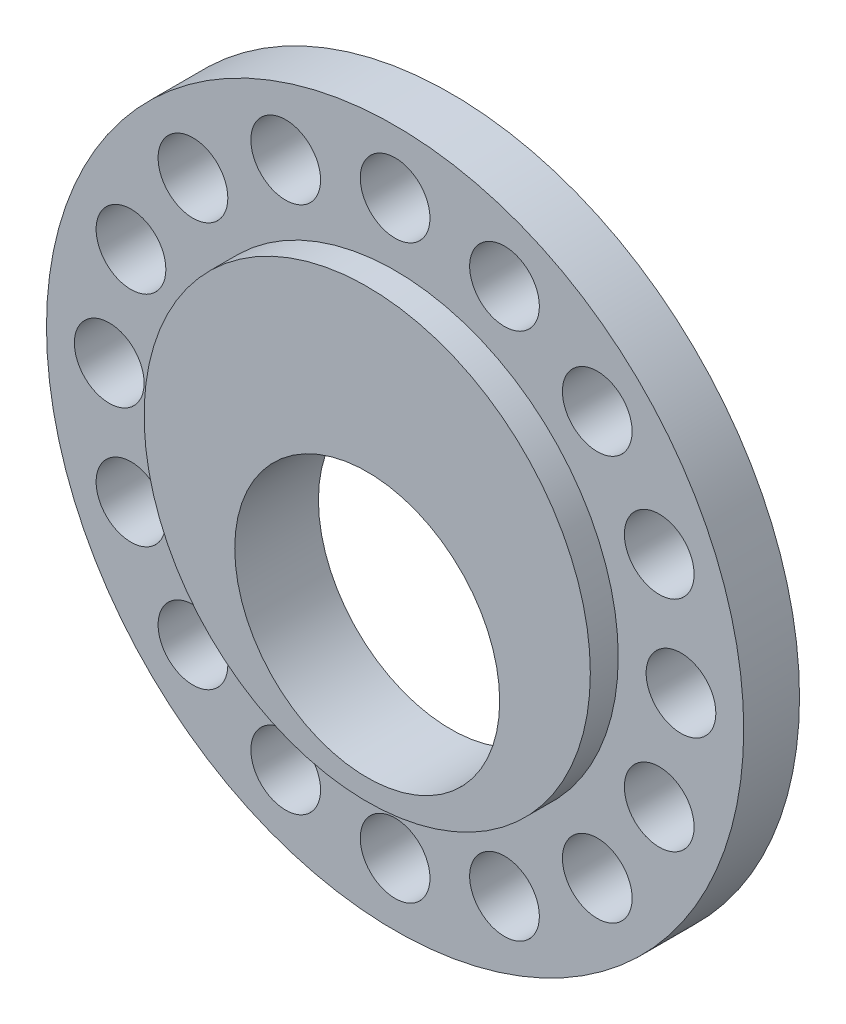
ISO-10303-21;
HEADER;
FILE_DESCRIPTION(('STEP AP214'),'2;1');
FILE_NAME('part.step','',(''),(''),'','','');
FILE_SCHEMA(('AUTOMOTIVE_DESIGN { 1 0 10303 214 1 1 1 1 }'));
ENDSEC;
DATA;
#1=APPLICATION_CONTEXT('core data for automotive mechanical design processes');
#2=APPLICATION_PROTOCOL_DEFINITION('international standard','automotive_design',2000,#1);
#3=PRODUCT_CONTEXT('',#1,'mechanical');
#4=PRODUCT('Part','Part','',(#3));
#5=PRODUCT_RELATED_PRODUCT_CATEGORY('part','',(#4));
#6=PRODUCT_DEFINITION_FORMATION('','',#4);
#7=PRODUCT_DEFINITION_CONTEXT('part definition',#1,'design');
#8=PRODUCT_DEFINITION('design','',#6,#7);
#9=PRODUCT_DEFINITION_SHAPE('','',#8);
#10=(LENGTH_UNIT() NAMED_UNIT(*) SI_UNIT(.MILLI.,.METRE.));
#11=(NAMED_UNIT(*) PLANE_ANGLE_UNIT() SI_UNIT($,.RADIAN.));
#12=(NAMED_UNIT(*) SI_UNIT($,.STERADIAN.) SOLID_ANGLE_UNIT());
#13=UNCERTAINTY_MEASURE_WITH_UNIT(LENGTH_MEASURE(1.E-05),#10,'distance_accuracy_value','');
#14=(GEOMETRIC_REPRESENTATION_CONTEXT(3) GLOBAL_UNCERTAINTY_ASSIGNED_CONTEXT((#13)) GLOBAL_UNIT_ASSIGNED_CONTEXT((#10,
#11,#12)) REPRESENTATION_CONTEXT('',''));
#15=CARTESIAN_POINT('',(0.,0.,0.));
#16=DIRECTION('',(0.,0.,1.));
#17=DIRECTION('',(1.,0.,0.));
#18=AXIS2_PLACEMENT_3D('',#15,#16,#17);
#19=CARTESIAN_POINT('',(0.,-5.,6.));
#20=DIRECTION('',(0.,0.,-1.));
#21=DIRECTION('',(-1.,0.,0.));
#22=AXIS2_PLACEMENT_3D('',#19,#20,#21);
#23=CYLINDRICAL_SURFACE('',#22,9.5);
#24=CARTESIAN_POINT('',(0.,-5.,6.));
#25=DIRECTION('',(0.,0.,1.));
#26=DIRECTION('',(1.,0.,0.));
#27=AXIS2_PLACEMENT_3D('',#24,#25,#26);
#28=CIRCLE('',#27,9.5);
#29=CARTESIAN_POINT('',(9.5,-5.,6.));
#30=VERTEX_POINT('',#29);
#31=EDGE_CURVE('E52',#30,#30,#28,.T.);
#32=ORIENTED_EDGE('',*,*,#31,.T.);
#33=EDGE_LOOP('',(#32));
#34=FACE_BOUND('',#33,.T.);
#35=CARTESIAN_POINT('',(0.,-5.,0.));
#36=DIRECTION('',(0.,0.,1.));
#37=DIRECTION('',(1.,0.,0.));
#38=AXIS2_PLACEMENT_3D('',#35,#36,#37);
#39=CIRCLE('',#38,9.5);
#40=CARTESIAN_POINT('',(9.5,-5.,0.));
#41=VERTEX_POINT('',#40);
#42=EDGE_CURVE('E47',#41,#41,#39,.T.);
#43=ORIENTED_EDGE('',*,*,#42,.F.);
#44=EDGE_LOOP('',(#43));
#45=FACE_BOUND('',#44,.T.);
#46=ADVANCED_FACE('F44',(#34,#45),#23,.F.);
#47=CARTESIAN_POINT('',(0.,0.,6.));
#48=DIRECTION('',(0.,0.,-1.));
#49=DIRECTION('',(-1.,0.,0.));
#50=AXIS2_PLACEMENT_3D('',#47,#48,#49);
#51=CYLINDRICAL_SURFACE('',#50,16.);
#52=CARTESIAN_POINT('',(0.,0.,4.));
#53=DIRECTION('',(0.,0.,1.));
#54=DIRECTION('',(1.,0.,0.));
#55=AXIS2_PLACEMENT_3D('',#52,#53,#54);
#56=CIRCLE('',#55,16.);
#57=CARTESIAN_POINT('',(16.,0.,4.));
#58=VERTEX_POINT('',#57);
#59=EDGE_CURVE('E159',#58,#58,#56,.T.);
#60=ORIENTED_EDGE('',*,*,#59,.T.);
#61=EDGE_LOOP('',(#60));
#62=FACE_BOUND('',#61,.T.);
#63=CARTESIAN_POINT('',(0.,0.,6.));
#64=DIRECTION('',(0.,0.,1.));
#65=DIRECTION('',(1.,0.,0.));
#66=AXIS2_PLACEMENT_3D('',#63,#64,#65);
#67=CIRCLE('',#66,16.);
#68=CARTESIAN_POINT('',(16.,0.,6.));
#69=VERTEX_POINT('',#68);
#70=EDGE_CURVE('E11',#69,#69,#67,.T.);
#71=ORIENTED_EDGE('',*,*,#70,.F.);
#72=EDGE_LOOP('',(#71));
#73=FACE_BOUND('',#72,.T.);
#74=ADVANCED_FACE('F231',(#62,#73),#51,.T.);
#75=CARTESIAN_POINT('',(0.,0.,6.));
#76=DIRECTION('',(0.,0.,1.));
#77=DIRECTION('',(1.,0.,0.));
#78=AXIS2_PLACEMENT_3D('',#75,#76,#77);
#79=PLANE('',#78);
#80=ORIENTED_EDGE('',*,*,#31,.F.);
#81=EDGE_LOOP('',(#80));
#82=FACE_BOUND('',#81,.T.);
#83=ORIENTED_EDGE('',*,*,#70,.T.);
#84=EDGE_LOOP('',(#83));
#85=FACE_BOUND('',#84,.T.);
#86=ADVANCED_FACE('F220',(#82,#85),#79,.T.);
#87=CARTESIAN_POINT('',(0.,0.,0.));
#88=DIRECTION('',(0.,0.,1.));
#89=DIRECTION('',(1.,0.,0.));
#90=AXIS2_PLACEMENT_3D('',#87,#88,#89);
#91=PLANE('',#90);
#92=ORIENTED_EDGE('',*,*,#42,.T.);
#93=EDGE_LOOP('',(#92));
#94=FACE_BOUND('',#93,.T.);
#95=CARTESIAN_POINT('',(-18.9395304164815,-7.84501036348408,0.));
#96=DIRECTION('',(0.,0.,1.));
#97=DIRECTION('',(1.,0.,0.));
#98=AXIS2_PLACEMENT_3D('',#95,#96,#97);
#99=CIRCLE('',#98,2.5);
#100=CARTESIAN_POINT('',(-16.4395304164815,-7.84501036348408,0.));
#101=VERTEX_POINT('',#100);
#102=EDGE_CURVE('E149',#101,#101,#99,.T.);
#103=ORIENTED_EDGE('',*,*,#102,.T.);
#104=EDGE_LOOP('',(#103));
#105=FACE_BOUND('',#104,.T.);
#106=CARTESIAN_POINT('',(-14.4956890143244,-14.495689014324,0.));
#107=DIRECTION('',(0.,0.,1.));
#108=DIRECTION('',(1.,0.,0.));
#109=AXIS2_PLACEMENT_3D('',#106,#107,#108);
#110=CIRCLE('',#109,2.5);
#111=CARTESIAN_POINT('',(-11.9956890143244,-14.495689014324,0.));
#112=VERTEX_POINT('',#111);
#113=EDGE_CURVE('E144',#112,#112,#110,.T.);
#114=ORIENTED_EDGE('',*,*,#113,.T.);
#115=EDGE_LOOP('',(#114));
#116=FACE_BOUND('',#115,.T.);
#117=CARTESIAN_POINT('',(-7.84501036348433,-18.9395304164814,0.));
#118=DIRECTION('',(0.,0.,1.));
#119=DIRECTION('',(1.,0.,0.));
#120=AXIS2_PLACEMENT_3D('',#117,#118,#119);
#121=CIRCLE('',#120,2.50000000000023);
#122=CARTESIAN_POINT('',(-5.34501036348409,-18.9395304164814,0.));
#123=VERTEX_POINT('',#122);
#124=EDGE_CURVE('E139',#123,#123,#121,.T.);
#125=ORIENTED_EDGE('',*,*,#124,.T.);
#126=EDGE_LOOP('',(#125));
#127=FACE_BOUND('',#126,.T.);
#128=CARTESIAN_POINT('',(0.,-20.5,0.));
#129=DIRECTION('',(0.,0.,1.));
#130=DIRECTION('',(1.,0.,0.));
#131=AXIS2_PLACEMENT_3D('',#128,#129,#130);
#132=CIRCLE('',#131,2.50000000000023);
#133=CARTESIAN_POINT('',(2.50000000000027,-20.5,0.));
#134=VERTEX_POINT('',#133);
#135=EDGE_CURVE('E135',#134,#134,#132,.T.);
#136=ORIENTED_EDGE('',*,*,#135,.T.);
#137=EDGE_LOOP('',(#136));
#138=FACE_BOUND('',#137,.T.);
#139=CARTESIAN_POINT('',(7.8450103634844,-18.9395304164814,0.));
#140=DIRECTION('',(0.,0.,1.));
#141=DIRECTION('',(1.,0.,0.));
#142=AXIS2_PLACEMENT_3D('',#139,#140,#141);
#143=CIRCLE('',#142,2.50000000000022);
#144=CARTESIAN_POINT('',(10.3450103634846,-18.9395304164814,0.));
#145=VERTEX_POINT('',#144);
#146=EDGE_CURVE('E127',#145,#145,#143,.T.);
#147=ORIENTED_EDGE('',*,*,#146,.T.);
#148=EDGE_LOOP('',(#147));
#149=FACE_BOUND('',#148,.T.);
#150=CARTESIAN_POINT('',(14.4956890143243,-14.4956890143243,0.));
#151=DIRECTION('',(0.,0.,1.));
#152=DIRECTION('',(1.,0.,0.));
#153=AXIS2_PLACEMENT_3D('',#150,#151,#152);
#154=CIRCLE('',#153,2.50000000000017);
#155=CARTESIAN_POINT('',(16.9956890143245,-14.4956890143243,0.));
#156=VERTEX_POINT('',#155);
#157=EDGE_CURVE('E122',#156,#156,#154,.T.);
#158=ORIENTED_EDGE('',*,*,#157,.T.);
#159=EDGE_LOOP('',(#158));
#160=FACE_BOUND('',#159,.T.);
#161=CARTESIAN_POINT('',(18.9395304164815,-7.84501036348437,0.));
#162=DIRECTION('',(0.,0.,1.));
#163=DIRECTION('',(1.,0.,0.));
#164=AXIS2_PLACEMENT_3D('',#161,#162,#163);
#165=CIRCLE('',#164,2.50000000000014);
#166=CARTESIAN_POINT('',(21.4395304164816,-7.84501036348437,0.));
#167=VERTEX_POINT('',#166);
#168=EDGE_CURVE('E117',#167,#167,#165,.T.);
#169=ORIENTED_EDGE('',*,*,#168,.T.);
#170=EDGE_LOOP('',(#169));
#171=FACE_BOUND('',#170,.T.);
#172=CARTESIAN_POINT('',(20.5000000000001,0.,0.));
#173=DIRECTION('',(0.,0.,1.));
#174=DIRECTION('',(1.,0.,0.));
#175=AXIS2_PLACEMENT_3D('',#172,#173,#174);
#176=CIRCLE('',#175,2.5000000000001);
#177=CARTESIAN_POINT('',(23.0000000000002,0.,0.));
#178=VERTEX_POINT('',#177);
#179=EDGE_CURVE('E113',#178,#178,#176,.T.);
#180=ORIENTED_EDGE('',*,*,#179,.T.);
#181=EDGE_LOOP('',(#180));
#182=FACE_BOUND('',#181,.T.);
#183=CARTESIAN_POINT('',(18.9395304164815,7.84501036348435,0.));
#184=DIRECTION('',(0.,0.,1.));
#185=DIRECTION('',(1.,0.,0.));
#186=AXIS2_PLACEMENT_3D('',#183,#184,#185);
#187=CIRCLE('',#186,2.50000000000007);
#188=CARTESIAN_POINT('',(21.4395304164815,7.84501036348435,0.));
#189=VERTEX_POINT('',#188);
#190=EDGE_CURVE('E105',#189,#189,#187,.T.);
#191=ORIENTED_EDGE('',*,*,#190,.T.);
#192=EDGE_LOOP('',(#191));
#193=FACE_BOUND('',#192,.T.);
#194=CARTESIAN_POINT('',(14.4956890143243,14.4956890143242,0.));
#195=DIRECTION('',(0.,0.,1.));
#196=DIRECTION('',(1.,0.,0.));
#197=AXIS2_PLACEMENT_3D('',#194,#195,#196);
#198=CIRCLE('',#197,2.50000000000005);
#199=CARTESIAN_POINT('',(16.9956890143243,14.4956890143242,0.));
#200=VERTEX_POINT('',#199);
#201=EDGE_CURVE('E100',#200,#200,#198,.T.);
#202=ORIENTED_EDGE('',*,*,#201,.T.);
#203=EDGE_LOOP('',(#202));
#204=FACE_BOUND('',#203,.T.);
#205=CARTESIAN_POINT('',(7.8450103634844,18.9395304164814,0.));
#206=DIRECTION('',(0.,0.,1.));
#207=DIRECTION('',(1.,0.,0.));
#208=AXIS2_PLACEMENT_3D('',#205,#206,#207);
#209=CIRCLE('',#208,2.50000000000003);
#210=CARTESIAN_POINT('',(10.3450103634844,18.9395304164814,0.));
#211=VERTEX_POINT('',#210);
#212=EDGE_CURVE('E95',#211,#211,#209,.T.);
#213=ORIENTED_EDGE('',*,*,#212,.T.);
#214=EDGE_LOOP('',(#213));
#215=FACE_BOUND('',#214,.T.);
#216=CARTESIAN_POINT('',(0.,20.5,0.));
#217=DIRECTION('',(0.,0.,1.));
#218=DIRECTION('',(1.,0.,0.));
#219=AXIS2_PLACEMENT_3D('',#216,#217,#218);
#220=CIRCLE('',#219,2.50000000000001);
#221=CARTESIAN_POINT('',(2.50000000000006,20.5,0.));
#222=VERTEX_POINT('',#221);
#223=EDGE_CURVE('E91',#222,#222,#220,.T.);
#224=ORIENTED_EDGE('',*,*,#223,.T.);
#225=EDGE_LOOP('',(#224));
#226=FACE_BOUND('',#225,.T.);
#227=CARTESIAN_POINT('',(-7.84501036348431,18.9395304164814,0.));
#228=DIRECTION('',(0.,0.,1.));
#229=DIRECTION('',(1.,0.,0.));
#230=AXIS2_PLACEMENT_3D('',#227,#228,#229);
#231=CIRCLE('',#230,2.50000000000001);
#232=CARTESIAN_POINT('',(-5.34501036348431,18.9395304164814,0.));
#233=VERTEX_POINT('',#232);
#234=EDGE_CURVE('E83',#233,#233,#231,.T.);
#235=ORIENTED_EDGE('',*,*,#234,.T.);
#236=EDGE_LOOP('',(#235));
#237=FACE_BOUND('',#236,.T.);
#238=CARTESIAN_POINT('',(-14.4956890143242,14.4956890143243,0.));
#239=DIRECTION('',(0.,0.,1.));
#240=DIRECTION('',(1.,0.,0.));
#241=AXIS2_PLACEMENT_3D('',#238,#239,#240);
#242=CIRCLE('',#241,2.5);
#243=CARTESIAN_POINT('',(-11.9956890143242,14.4956890143243,0.));
#244=VERTEX_POINT('',#243);
#245=EDGE_CURVE('E78',#244,#244,#242,.T.);
#246=ORIENTED_EDGE('',*,*,#245,.T.);
#247=EDGE_LOOP('',(#246));
#248=FACE_BOUND('',#247,.T.);
#249=CARTESIAN_POINT('',(-18.9395304164814,7.84501036348436,0.));
#250=DIRECTION('',(0.,0.,1.));
#251=DIRECTION('',(1.,0.,0.));
#252=AXIS2_PLACEMENT_3D('',#249,#250,#251);
#253=CIRCLE('',#252,2.5);
#254=CARTESIAN_POINT('',(-16.4395304164814,7.84501036348436,0.));
#255=VERTEX_POINT('',#254);
#256=EDGE_CURVE('E73',#255,#255,#253,.T.);
#257=ORIENTED_EDGE('',*,*,#256,.T.);
#258=EDGE_LOOP('',(#257));
#259=FACE_BOUND('',#258,.T.);
#260=CARTESIAN_POINT('',(-20.5,0.,0.));
#261=DIRECTION('',(0.,0.,1.));
#262=DIRECTION('',(1.,0.,0.));
#263=AXIS2_PLACEMENT_3D('',#260,#261,#262);
#264=CIRCLE('',#263,2.5);
#265=CARTESIAN_POINT('',(-18.,0.,0.));
#266=VERTEX_POINT('',#265);
#267=EDGE_CURVE('E69',#266,#266,#264,.T.);
#268=ORIENTED_EDGE('',*,*,#267,.T.);
#269=EDGE_LOOP('',(#268));
#270=FACE_BOUND('',#269,.T.);
#271=CARTESIAN_POINT('',(0.,0.,0.));
#272=DIRECTION('',(0.,0.,1.));
#273=DIRECTION('',(1.,0.,0.));
#274=AXIS2_PLACEMENT_3D('',#271,#272,#273);
#275=CIRCLE('',#274,25.);
#276=CARTESIAN_POINT('',(25.,0.,0.));
#277=VERTEX_POINT('',#276);
#278=EDGE_CURVE('E61',#277,#277,#275,.T.);
#279=ORIENTED_EDGE('',*,*,#278,.F.);
#280=EDGE_LOOP('',(#279));
#281=FACE_BOUND('',#280,.T.);
#282=ADVANCED_FACE('F217',(#94,#105,#116,#127,#138,#149,#160,#171,#182,#193,#204,#215,#226,#237,
#248,#259,#270,#281),#91,.F.);
#283=CARTESIAN_POINT('',(-20.5,0.,4.));
#284=DIRECTION('',(0.,0.,-1.));
#285=DIRECTION('',(-1.,0.,0.));
#286=AXIS2_PLACEMENT_3D('',#283,#284,#285);
#287=CYLINDRICAL_SURFACE('',#286,2.5);
#288=CARTESIAN_POINT('',(-20.5,0.,4.));
#289=DIRECTION('',(0.,0.,1.));
#290=DIRECTION('',(1.,0.,0.));
#291=AXIS2_PLACEMENT_3D('',#288,#289,#290);
#292=CIRCLE('',#291,2.5);
#293=CARTESIAN_POINT('',(-18.,0.,4.));
#294=VERTEX_POINT('',#293);
#295=EDGE_CURVE('E162',#294,#294,#292,.T.);
#296=ORIENTED_EDGE('',*,*,#295,.T.);
#297=EDGE_LOOP('',(#296));
#298=FACE_BOUND('',#297,.T.);
#299=ORIENTED_EDGE('',*,*,#267,.F.);
#300=EDGE_LOOP('',(#299));
#301=FACE_BOUND('',#300,.T.);
#302=ADVANCED_FACE('F219',(#298,#301),#287,.F.);
#303=CARTESIAN_POINT('',(-18.9395304164814,7.84501036348436,4.));
#304=DIRECTION('',(0.,0.,-1.));
#305=DIRECTION('',(-1.,0.,0.));
#306=AXIS2_PLACEMENT_3D('',#303,#304,#305);
#307=CYLINDRICAL_SURFACE('',#306,2.5);
#308=CARTESIAN_POINT('',(-18.9395304164814,7.84501036348436,4.));
#309=DIRECTION('',(0.,0.,1.));
#310=DIRECTION('',(1.,0.,0.));
#311=AXIS2_PLACEMENT_3D('',#308,#309,#310);
#312=CIRCLE('',#311,2.5);
#313=CARTESIAN_POINT('',(-16.4395304164814,7.84501036348436,4.));
#314=VERTEX_POINT('',#313);
#315=EDGE_CURVE('E165',#314,#314,#312,.T.);
#316=ORIENTED_EDGE('',*,*,#315,.T.);
#317=EDGE_LOOP('',(#316));
#318=FACE_BOUND('',#317,.T.);
#319=ORIENTED_EDGE('',*,*,#256,.F.);
#320=EDGE_LOOP('',(#319));
#321=FACE_BOUND('',#320,.T.);
#322=ADVANCED_FACE('F227',(#318,#321),#307,.F.);
#323=CARTESIAN_POINT('',(-14.4956890143242,14.4956890143243,4.));
#324=DIRECTION('',(0.,0.,-1.));
#325=DIRECTION('',(-1.,0.,0.));
#326=AXIS2_PLACEMENT_3D('',#323,#324,#325);
#327=CYLINDRICAL_SURFACE('',#326,2.5);
#328=CARTESIAN_POINT('',(-14.4956890143242,14.4956890143243,4.));
#329=DIRECTION('',(0.,0.,1.));
#330=DIRECTION('',(1.,0.,0.));
#331=AXIS2_PLACEMENT_3D('',#328,#329,#330);
#332=CIRCLE('',#331,2.5);
#333=CARTESIAN_POINT('',(-11.9956890143242,14.4956890143243,4.));
#334=VERTEX_POINT('',#333);
#335=EDGE_CURVE('E168',#334,#334,#332,.T.);
#336=ORIENTED_EDGE('',*,*,#335,.T.);
#337=EDGE_LOOP('',(#336));
#338=FACE_BOUND('',#337,.T.);
#339=ORIENTED_EDGE('',*,*,#245,.F.);
#340=EDGE_LOOP('',(#339));
#341=FACE_BOUND('',#340,.T.);
#342=ADVANCED_FACE('F258',(#338,#341),#327,.F.);
#343=CARTESIAN_POINT('',(-7.84501036348431,18.9395304164814,4.));
#344=DIRECTION('',(0.,0.,-1.));
#345=DIRECTION('',(-1.,0.,0.));
#346=AXIS2_PLACEMENT_3D('',#343,#344,#345);
#347=CYLINDRICAL_SURFACE('',#346,2.50000000000001);
#348=CARTESIAN_POINT('',(-7.84501036348431,18.9395304164814,4.));
#349=DIRECTION('',(0.,0.,1.));
#350=DIRECTION('',(1.,0.,0.));
#351=AXIS2_PLACEMENT_3D('',#348,#349,#350);
#352=CIRCLE('',#351,2.50000000000001);
#353=CARTESIAN_POINT('',(-5.34501036348431,18.9395304164814,4.));
#354=VERTEX_POINT('',#353);
#355=EDGE_CURVE('E171',#354,#354,#352,.T.);
#356=ORIENTED_EDGE('',*,*,#355,.T.);
#357=EDGE_LOOP('',(#356));
#358=FACE_BOUND('',#357,.T.);
#359=ORIENTED_EDGE('',*,*,#234,.F.);
#360=EDGE_LOOP('',(#359));
#361=FACE_BOUND('',#360,.T.);
#362=ADVANCED_FACE('F255',(#358,#361),#347,.F.);
#363=CARTESIAN_POINT('',(0.,20.5,4.));
#364=DIRECTION('',(0.,0.,-1.));
#365=DIRECTION('',(-1.,0.,0.));
#366=AXIS2_PLACEMENT_3D('',#363,#364,#365);
#367=CYLINDRICAL_SURFACE('',#366,2.50000000000001);
#368=CARTESIAN_POINT('',(0.,20.5,4.));
#369=DIRECTION('',(0.,0.,1.));
#370=DIRECTION('',(1.,0.,0.));
#371=AXIS2_PLACEMENT_3D('',#368,#369,#370);
#372=CIRCLE('',#371,2.50000000000001);
#373=CARTESIAN_POINT('',(2.50000000000006,20.5,4.));
#374=VERTEX_POINT('',#373);
#375=EDGE_CURVE('E174',#374,#374,#372,.T.);
#376=ORIENTED_EDGE('',*,*,#375,.T.);
#377=EDGE_LOOP('',(#376));
#378=FACE_BOUND('',#377,.T.);
#379=ORIENTED_EDGE('',*,*,#223,.F.);
#380=EDGE_LOOP('',(#379));
#381=FACE_BOUND('',#380,.T.);
#382=ADVANCED_FACE('F257',(#378,#381),#367,.F.);
#383=CARTESIAN_POINT('',(7.8450103634844,18.9395304164814,4.));
#384=DIRECTION('',(0.,0.,-1.));
#385=DIRECTION('',(-1.,0.,0.));
#386=AXIS2_PLACEMENT_3D('',#383,#384,#385);
#387=CYLINDRICAL_SURFACE('',#386,2.50000000000003);
#388=CARTESIAN_POINT('',(7.8450103634844,18.9395304164814,4.));
#389=DIRECTION('',(0.,0.,1.));
#390=DIRECTION('',(1.,0.,0.));
#391=AXIS2_PLACEMENT_3D('',#388,#389,#390);
#392=CIRCLE('',#391,2.50000000000003);
#393=CARTESIAN_POINT('',(10.3450103634844,18.9395304164814,4.));
#394=VERTEX_POINT('',#393);
#395=EDGE_CURVE('E177',#394,#394,#392,.T.);
#396=ORIENTED_EDGE('',*,*,#395,.T.);
#397=EDGE_LOOP('',(#396));
#398=FACE_BOUND('',#397,.T.);
#399=ORIENTED_EDGE('',*,*,#212,.F.);
#400=EDGE_LOOP('',(#399));
#401=FACE_BOUND('',#400,.T.);
#402=ADVANCED_FACE('F265',(#398,#401),#387,.F.);
#403=CARTESIAN_POINT('',(14.4956890143243,14.4956890143242,4.));
#404=DIRECTION('',(0.,0.,-1.));
#405=DIRECTION('',(-1.,0.,0.));
#406=AXIS2_PLACEMENT_3D('',#403,#404,#405);
#407=CYLINDRICAL_SURFACE('',#406,2.50000000000005);
#408=CARTESIAN_POINT('',(14.4956890143243,14.4956890143242,4.));
#409=DIRECTION('',(0.,0.,1.));
#410=DIRECTION('',(1.,0.,0.));
#411=AXIS2_PLACEMENT_3D('',#408,#409,#410);
#412=CIRCLE('',#411,2.50000000000005);
#413=CARTESIAN_POINT('',(16.9956890143243,14.4956890143242,4.));
#414=VERTEX_POINT('',#413);
#415=EDGE_CURVE('E180',#414,#414,#412,.T.);
#416=ORIENTED_EDGE('',*,*,#415,.T.);
#417=EDGE_LOOP('',(#416));
#418=FACE_BOUND('',#417,.T.);
#419=ORIENTED_EDGE('',*,*,#201,.F.);
#420=EDGE_LOOP('',(#419));
#421=FACE_BOUND('',#420,.T.);
#422=ADVANCED_FACE('F274',(#418,#421),#407,.F.);
#423=CARTESIAN_POINT('',(18.9395304164815,7.84501036348435,4.));
#424=DIRECTION('',(0.,0.,-1.));
#425=DIRECTION('',(-1.,0.,0.));
#426=AXIS2_PLACEMENT_3D('',#423,#424,#425);
#427=CYLINDRICAL_SURFACE('',#426,2.50000000000007);
#428=CARTESIAN_POINT('',(18.9395304164815,7.84501036348435,4.));
#429=DIRECTION('',(0.,0.,1.));
#430=DIRECTION('',(1.,0.,0.));
#431=AXIS2_PLACEMENT_3D('',#428,#429,#430);
#432=CIRCLE('',#431,2.50000000000007);
#433=CARTESIAN_POINT('',(21.4395304164815,7.84501036348435,4.));
#434=VERTEX_POINT('',#433);
#435=EDGE_CURVE('E183',#434,#434,#432,.T.);
#436=ORIENTED_EDGE('',*,*,#435,.T.);
#437=EDGE_LOOP('',(#436));
#438=FACE_BOUND('',#437,.T.);
#439=ORIENTED_EDGE('',*,*,#190,.F.);
#440=EDGE_LOOP('',(#439));
#441=FACE_BOUND('',#440,.T.);
#442=ADVANCED_FACE('F278',(#438,#441),#427,.F.);
#443=CARTESIAN_POINT('',(20.5000000000001,0.,4.));
#444=DIRECTION('',(0.,0.,-1.));
#445=DIRECTION('',(-1.,0.,0.));
#446=AXIS2_PLACEMENT_3D('',#443,#444,#445);
#447=CYLINDRICAL_SURFACE('',#446,2.5000000000001);
#448=CARTESIAN_POINT('',(20.5000000000001,0.,4.));
#449=DIRECTION('',(0.,0.,1.));
#450=DIRECTION('',(1.,0.,0.));
#451=AXIS2_PLACEMENT_3D('',#448,#449,#450);
#452=CIRCLE('',#451,2.5000000000001);
#453=CARTESIAN_POINT('',(23.0000000000002,0.,4.));
#454=VERTEX_POINT('',#453);
#455=EDGE_CURVE('E186',#454,#454,#452,.T.);
#456=ORIENTED_EDGE('',*,*,#455,.T.);
#457=EDGE_LOOP('',(#456));
#458=FACE_BOUND('',#457,.T.);
#459=ORIENTED_EDGE('',*,*,#179,.F.);
#460=EDGE_LOOP('',(#459));
#461=FACE_BOUND('',#460,.T.);
#462=ADVANCED_FACE('F282',(#458,#461),#447,.F.);
#463=CARTESIAN_POINT('',(18.9395304164815,-7.84501036348437,4.));
#464=DIRECTION('',(0.,0.,-1.));
#465=DIRECTION('',(-1.,0.,0.));
#466=AXIS2_PLACEMENT_3D('',#463,#464,#465);
#467=CYLINDRICAL_SURFACE('',#466,2.50000000000014);
#468=CARTESIAN_POINT('',(18.9395304164815,-7.84501036348437,4.));
#469=DIRECTION('',(0.,0.,1.));
#470=DIRECTION('',(1.,0.,0.));
#471=AXIS2_PLACEMENT_3D('',#468,#469,#470);
#472=CIRCLE('',#471,2.50000000000014);
#473=CARTESIAN_POINT('',(21.4395304164816,-7.84501036348437,4.));
#474=VERTEX_POINT('',#473);
#475=EDGE_CURVE('E189',#474,#474,#472,.T.);
#476=ORIENTED_EDGE('',*,*,#475,.T.);
#477=EDGE_LOOP('',(#476));
#478=FACE_BOUND('',#477,.T.);
#479=ORIENTED_EDGE('',*,*,#168,.F.);
#480=EDGE_LOOP('',(#479));
#481=FACE_BOUND('',#480,.T.);
#482=ADVANCED_FACE('F286',(#478,#481),#467,.F.);
#483=CARTESIAN_POINT('',(14.4956890143243,-14.4956890143243,4.));
#484=DIRECTION('',(0.,0.,-1.));
#485=DIRECTION('',(-1.,0.,0.));
#486=AXIS2_PLACEMENT_3D('',#483,#484,#485);
#487=CYLINDRICAL_SURFACE('',#486,2.50000000000017);
#488=CARTESIAN_POINT('',(14.4956890143243,-14.4956890143243,4.));
#489=DIRECTION('',(0.,0.,1.));
#490=DIRECTION('',(1.,0.,0.));
#491=AXIS2_PLACEMENT_3D('',#488,#489,#490);
#492=CIRCLE('',#491,2.50000000000017);
#493=CARTESIAN_POINT('',(16.9956890143245,-14.4956890143243,4.));
#494=VERTEX_POINT('',#493);
#495=EDGE_CURVE('E192',#494,#494,#492,.T.);
#496=ORIENTED_EDGE('',*,*,#495,.T.);
#497=EDGE_LOOP('',(#496));
#498=FACE_BOUND('',#497,.T.);
#499=ORIENTED_EDGE('',*,*,#157,.F.);
#500=EDGE_LOOP('',(#499));
#501=FACE_BOUND('',#500,.T.);
#502=ADVANCED_FACE('F290',(#498,#501),#487,.F.);
#503=CARTESIAN_POINT('',(7.8450103634844,-18.9395304164814,4.));
#504=DIRECTION('',(0.,0.,-1.));
#505=DIRECTION('',(-1.,0.,0.));
#506=AXIS2_PLACEMENT_3D('',#503,#504,#505);
#507=CYLINDRICAL_SURFACE('',#506,2.50000000000022);
#508=CARTESIAN_POINT('',(7.8450103634844,-18.9395304164814,4.));
#509=DIRECTION('',(0.,0.,1.));
#510=DIRECTION('',(1.,0.,0.));
#511=AXIS2_PLACEMENT_3D('',#508,#509,#510);
#512=CIRCLE('',#511,2.50000000000022);
#513=CARTESIAN_POINT('',(10.3450103634846,-18.9395304164814,4.));
#514=VERTEX_POINT('',#513);
#515=EDGE_CURVE('E195',#514,#514,#512,.T.);
#516=ORIENTED_EDGE('',*,*,#515,.T.);
#517=EDGE_LOOP('',(#516));
#518=FACE_BOUND('',#517,.T.);
#519=ORIENTED_EDGE('',*,*,#146,.F.);
#520=EDGE_LOOP('',(#519));
#521=FACE_BOUND('',#520,.T.);
#522=ADVANCED_FACE('F294',(#518,#521),#507,.F.);
#523=CARTESIAN_POINT('',(0.,-20.5,4.));
#524=DIRECTION('',(0.,0.,-1.));
#525=DIRECTION('',(-1.,0.,0.));
#526=AXIS2_PLACEMENT_3D('',#523,#524,#525);
#527=CYLINDRICAL_SURFACE('',#526,2.50000000000023);
#528=CARTESIAN_POINT('',(0.,-20.5,4.));
#529=DIRECTION('',(0.,0.,1.));
#530=DIRECTION('',(1.,0.,0.));
#531=AXIS2_PLACEMENT_3D('',#528,#529,#530);
#532=CIRCLE('',#531,2.50000000000023);
#533=CARTESIAN_POINT('',(2.50000000000027,-20.5,4.));
#534=VERTEX_POINT('',#533);
#535=EDGE_CURVE('E198',#534,#534,#532,.T.);
#536=ORIENTED_EDGE('',*,*,#535,.T.);
#537=EDGE_LOOP('',(#536));
#538=FACE_BOUND('',#537,.T.);
#539=ORIENTED_EDGE('',*,*,#135,.F.);
#540=EDGE_LOOP('',(#539));
#541=FACE_BOUND('',#540,.T.);
#542=ADVANCED_FACE('F298',(#538,#541),#527,.F.);
#543=CARTESIAN_POINT('',(-7.84501036348433,-18.9395304164814,4.));
#544=DIRECTION('',(0.,0.,-1.));
#545=DIRECTION('',(-1.,0.,0.));
#546=AXIS2_PLACEMENT_3D('',#543,#544,#545);
#547=CYLINDRICAL_SURFACE('',#546,2.50000000000023);
#548=CARTESIAN_POINT('',(-7.84501036348433,-18.9395304164814,4.));
#549=DIRECTION('',(0.,0.,1.));
#550=DIRECTION('',(1.,0.,0.));
#551=AXIS2_PLACEMENT_3D('',#548,#549,#550);
#552=CIRCLE('',#551,2.50000000000023);
#553=CARTESIAN_POINT('',(-5.34501036348409,-18.9395304164814,4.));
#554=VERTEX_POINT('',#553);
#555=EDGE_CURVE('E201',#554,#554,#552,.T.);
#556=ORIENTED_EDGE('',*,*,#555,.T.);
#557=EDGE_LOOP('',(#556));
#558=FACE_BOUND('',#557,.T.);
#559=ORIENTED_EDGE('',*,*,#124,.F.);
#560=EDGE_LOOP('',(#559));
#561=FACE_BOUND('',#560,.T.);
#562=ADVANCED_FACE('F302',(#558,#561),#547,.F.);
#563=CARTESIAN_POINT('',(-14.4956890143244,-14.495689014324,4.));
#564=DIRECTION('',(0.,0.,-1.));
#565=DIRECTION('',(-1.,0.,0.));
#566=AXIS2_PLACEMENT_3D('',#563,#564,#565);
#567=CYLINDRICAL_SURFACE('',#566,2.5);
#568=CARTESIAN_POINT('',(-14.4956890143244,-14.495689014324,4.));
#569=DIRECTION('',(0.,0.,1.));
#570=DIRECTION('',(1.,0.,0.));
#571=AXIS2_PLACEMENT_3D('',#568,#569,#570);
#572=CIRCLE('',#571,2.5);
#573=CARTESIAN_POINT('',(-11.9956890143244,-14.495689014324,4.));
#574=VERTEX_POINT('',#573);
#575=EDGE_CURVE('E204',#574,#574,#572,.T.);
#576=ORIENTED_EDGE('',*,*,#575,.T.);
#577=EDGE_LOOP('',(#576));
#578=FACE_BOUND('',#577,.T.);
#579=ORIENTED_EDGE('',*,*,#113,.F.);
#580=EDGE_LOOP('',(#579));
#581=FACE_BOUND('',#580,.T.);
#582=ADVANCED_FACE('F306',(#578,#581),#567,.F.);
#583=CARTESIAN_POINT('',(-18.9395304164815,-7.84501036348408,4.));
#584=DIRECTION('',(0.,0.,-1.));
#585=DIRECTION('',(-1.,0.,0.));
#586=AXIS2_PLACEMENT_3D('',#583,#584,#585);
#587=CYLINDRICAL_SURFACE('',#586,2.5);
#588=CARTESIAN_POINT('',(-18.9395304164815,-7.84501036348408,4.));
#589=DIRECTION('',(0.,0.,1.));
#590=DIRECTION('',(1.,0.,0.));
#591=AXIS2_PLACEMENT_3D('',#588,#589,#590);
#592=CIRCLE('',#591,2.5);
#593=CARTESIAN_POINT('',(-16.4395304164815,-7.84501036348408,4.));
#594=VERTEX_POINT('',#593);
#595=EDGE_CURVE('E207',#594,#594,#592,.T.);
#596=ORIENTED_EDGE('',*,*,#595,.T.);
#597=EDGE_LOOP('',(#596));
#598=FACE_BOUND('',#597,.T.);
#599=ORIENTED_EDGE('',*,*,#102,.F.);
#600=EDGE_LOOP('',(#599));
#601=FACE_BOUND('',#600,.T.);
#602=ADVANCED_FACE('F310',(#598,#601),#587,.F.);
#603=CARTESIAN_POINT('',(0.,0.,4.));
#604=DIRECTION('',(0.,0.,-1.));
#605=DIRECTION('',(-1.,0.,0.));
#606=AXIS2_PLACEMENT_3D('',#603,#604,#605);
#607=CYLINDRICAL_SURFACE('',#606,25.);
#608=CARTESIAN_POINT('',(0.,0.,4.));
#609=DIRECTION('',(0.,0.,1.));
#610=DIRECTION('',(1.,0.,0.));
#611=AXIS2_PLACEMENT_3D('',#608,#609,#610);
#612=CIRCLE('',#611,25.);
#613=CARTESIAN_POINT('',(25.,0.,4.));
#614=VERTEX_POINT('',#613);
#615=EDGE_CURVE('E156',#614,#614,#612,.T.);
#616=ORIENTED_EDGE('',*,*,#615,.F.);
#617=EDGE_LOOP('',(#616));
#618=FACE_BOUND('',#617,.T.);
#619=ORIENTED_EDGE('',*,*,#278,.T.);
#620=EDGE_LOOP('',(#619));
#621=FACE_BOUND('',#620,.T.);
#622=ADVANCED_FACE('F215',(#618,#621),#607,.T.);
#623=CARTESIAN_POINT('',(0.,0.,4.));
#624=DIRECTION('',(0.,0.,1.));
#625=DIRECTION('',(1.,0.,0.));
#626=AXIS2_PLACEMENT_3D('',#623,#624,#625);
#627=PLANE('',#626);
#628=ORIENTED_EDGE('',*,*,#595,.F.);
#629=EDGE_LOOP('',(#628));
#630=FACE_BOUND('',#629,.T.);
#631=ORIENTED_EDGE('',*,*,#575,.F.);
#632=EDGE_LOOP('',(#631));
#633=FACE_BOUND('',#632,.T.);
#634=ORIENTED_EDGE('',*,*,#555,.F.);
#635=EDGE_LOOP('',(#634));
#636=FACE_BOUND('',#635,.T.);
#637=ORIENTED_EDGE('',*,*,#535,.F.);
#638=EDGE_LOOP('',(#637));
#639=FACE_BOUND('',#638,.T.);
#640=ORIENTED_EDGE('',*,*,#515,.F.);
#641=EDGE_LOOP('',(#640));
#642=FACE_BOUND('',#641,.T.);
#643=ORIENTED_EDGE('',*,*,#495,.F.);
#644=EDGE_LOOP('',(#643));
#645=FACE_BOUND('',#644,.T.);
#646=ORIENTED_EDGE('',*,*,#475,.F.);
#647=EDGE_LOOP('',(#646));
#648=FACE_BOUND('',#647,.T.);
#649=ORIENTED_EDGE('',*,*,#455,.F.);
#650=EDGE_LOOP('',(#649));
#651=FACE_BOUND('',#650,.T.);
#652=ORIENTED_EDGE('',*,*,#435,.F.);
#653=EDGE_LOOP('',(#652));
#654=FACE_BOUND('',#653,.T.);
#655=ORIENTED_EDGE('',*,*,#415,.F.);
#656=EDGE_LOOP('',(#655));
#657=FACE_BOUND('',#656,.T.);
#658=ORIENTED_EDGE('',*,*,#395,.F.);
#659=EDGE_LOOP('',(#658));
#660=FACE_BOUND('',#659,.T.);
#661=ORIENTED_EDGE('',*,*,#375,.F.);
#662=EDGE_LOOP('',(#661));
#663=FACE_BOUND('',#662,.T.);
#664=ORIENTED_EDGE('',*,*,#355,.F.);
#665=EDGE_LOOP('',(#664));
#666=FACE_BOUND('',#665,.T.);
#667=ORIENTED_EDGE('',*,*,#335,.F.);
#668=EDGE_LOOP('',(#667));
#669=FACE_BOUND('',#668,.T.);
#670=ORIENTED_EDGE('',*,*,#315,.F.);
#671=EDGE_LOOP('',(#670));
#672=FACE_BOUND('',#671,.T.);
#673=ORIENTED_EDGE('',*,*,#295,.F.);
#674=EDGE_LOOP('',(#673));
#675=FACE_BOUND('',#674,.T.);
#676=ORIENTED_EDGE('',*,*,#59,.F.);
#677=EDGE_LOOP('',(#676));
#678=FACE_BOUND('',#677,.T.);
#679=ORIENTED_EDGE('',*,*,#615,.T.);
#680=EDGE_LOOP('',(#679));
#681=FACE_BOUND('',#680,.T.);
#682=ADVANCED_FACE('F316',(#630,#633,#636,#639,#642,#645,#648,#651,#654,#657,#660,#663,#666,
#669,#672,#675,#678,#681),#627,.T.);
#683=CLOSED_SHELL('',(#46,#74,#86,#282,#302,#322,#342,#362,#382,#402,#422,#442,#462,#482,#502,
#522,#542,#562,#582,#602,#622,#682));
#684=MANIFOLD_SOLID_BREP('B2',#683);
#685=ADVANCED_BREP_SHAPE_REPRESENTATION('',(#18,#684),#14);
#686=SHAPE_DEFINITION_REPRESENTATION(#9,#685);
ENDSEC;
END-ISO-10303-21;
